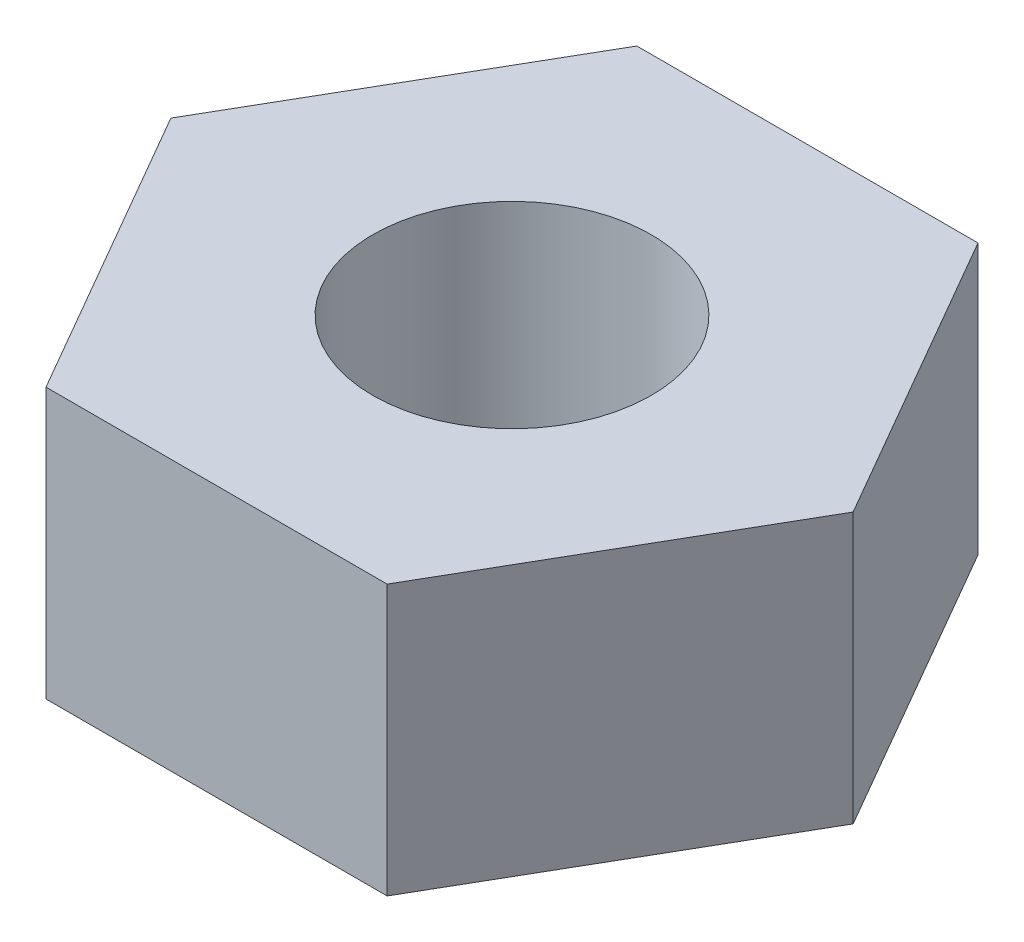
ISO-10303-21;
HEADER;
FILE_DESCRIPTION(('STEP AP214'),'2;1');
FILE_NAME('part.step','',(''),(''),'','','');
FILE_SCHEMA(('AUTOMOTIVE_DESIGN { 1 0 10303 214 1 1 1 1 }'));
ENDSEC;
DATA;
#1=APPLICATION_CONTEXT('core data for automotive mechanical design processes');
#2=APPLICATION_PROTOCOL_DEFINITION('international standard','automotive_design',2000,#1);
#3=PRODUCT_CONTEXT('',#1,'mechanical');
#4=PRODUCT('Part','Part','',(#3));
#5=PRODUCT_RELATED_PRODUCT_CATEGORY('part','',(#4));
#6=PRODUCT_DEFINITION_FORMATION('','',#4);
#7=PRODUCT_DEFINITION_CONTEXT('part definition',#1,'design');
#8=PRODUCT_DEFINITION('design','',#6,#7);
#9=PRODUCT_DEFINITION_SHAPE('','',#8);
#10=(LENGTH_UNIT() NAMED_UNIT(*) SI_UNIT(.MILLI.,.METRE.));
#11=(NAMED_UNIT(*) PLANE_ANGLE_UNIT() SI_UNIT($,.RADIAN.));
#12=(NAMED_UNIT(*) SI_UNIT($,.STERADIAN.) SOLID_ANGLE_UNIT());
#13=UNCERTAINTY_MEASURE_WITH_UNIT(LENGTH_MEASURE(1.E-05),#10,'distance_accuracy_value','');
#14=(GEOMETRIC_REPRESENTATION_CONTEXT(3) GLOBAL_UNCERTAINTY_ASSIGNED_CONTEXT((#13)) GLOBAL_UNIT_ASSIGNED_CONTEXT((#10,
#11,#12)) REPRESENTATION_CONTEXT('',''));
#15=CARTESIAN_POINT('',(0.,0.,0.));
#16=DIRECTION('',(0.,0.,1.));
#17=DIRECTION('',(1.,0.,0.));
#18=AXIS2_PLACEMENT_3D('',#15,#16,#17);
#19=CARTESIAN_POINT('',(0.,3.2,-3.5));
#20=DIRECTION('',(0.,0.,1.));
#21=DIRECTION('',(1.,0.,0.));
#22=AXIS2_PLACEMENT_3D('',#19,#20,#21);
#23=PLANE('',#22);
#24=DIRECTION('',(-1.,0.,0.));
#25=VECTOR('',#24,1.);
#26=CARTESIAN_POINT('',(0.,0.,-3.5));
#27=LINE('',#26,#25);
#28=CARTESIAN_POINT('',(2.02072594216369,0.,-3.5));
#29=VERTEX_POINT('',#28);
#30=CARTESIAN_POINT('',(-2.02072594216369,0.,-3.5));
#31=VERTEX_POINT('',#30);
#32=EDGE_CURVE('E132',#29,#31,#27,.T.);
#33=ORIENTED_EDGE('',*,*,#32,.T.);
#34=DIRECTION('',(0.,-1.,0.));
#35=VECTOR('',#34,1.);
#36=CARTESIAN_POINT('',(-2.02072594216369,3.2,-3.5));
#37=LINE('',#36,#35);
#38=CARTESIAN_POINT('',(-2.02072594216369,3.2,-3.5));
#39=VERTEX_POINT('',#38);
#40=EDGE_CURVE('E11',#39,#31,#37,.T.);
#41=ORIENTED_EDGE('',*,*,#40,.F.);
#42=DIRECTION('',(-1.,0.,0.));
#43=VECTOR('',#42,1.);
#44=CARTESIAN_POINT('',(0.,3.2,-3.5));
#45=LINE('',#44,#43);
#46=CARTESIAN_POINT('',(2.02072594216369,3.2,-3.5));
#47=VERTEX_POINT('',#46);
#48=EDGE_CURVE('E149',#47,#39,#45,.T.);
#49=ORIENTED_EDGE('',*,*,#48,.F.);
#50=DIRECTION('',(0.,-1.,0.));
#51=VECTOR('',#50,1.);
#52=CARTESIAN_POINT('',(2.02072594216369,3.2,-3.5));
#53=LINE('',#52,#51);
#54=EDGE_CURVE('E128',#47,#29,#53,.T.);
#55=ORIENTED_EDGE('',*,*,#54,.T.);
#56=EDGE_LOOP('',(#33,#41,#49,#55));
#57=FACE_BOUND('',#56,.T.);
#58=ADVANCED_FACE('F43',(#57),#23,.F.);
#59=CARTESIAN_POINT('',(-3.03108891324553,3.2,-1.75));
#60=DIRECTION('',(0.866025403784439,0.,0.5));
#61=DIRECTION('',(0.5,0.,-0.866025403784439));
#62=AXIS2_PLACEMENT_3D('',#59,#60,#61);
#63=PLANE('',#62);
#64=DIRECTION('',(-0.5,0.,0.866025403784439));
#65=VECTOR('',#64,1.);
#66=CARTESIAN_POINT('',(-3.03108891324553,0.,-1.75));
#67=LINE('',#66,#65);
#68=CARTESIAN_POINT('',(-4.04145188432738,0.,0.));
#69=VERTEX_POINT('',#68);
#70=EDGE_CURVE('E136',#31,#69,#67,.T.);
#71=ORIENTED_EDGE('',*,*,#70,.T.);
#72=DIRECTION('',(0.,-1.,0.));
#73=VECTOR('',#72,1.);
#74=CARTESIAN_POINT('',(-4.04145188432738,3.2,0.));
#75=LINE('',#74,#73);
#76=CARTESIAN_POINT('',(-4.04145188432738,3.2,0.));
#77=VERTEX_POINT('',#76);
#78=EDGE_CURVE('E52',#77,#69,#75,.T.);
#79=ORIENTED_EDGE('',*,*,#78,.F.);
#80=DIRECTION('',(-0.5,0.,0.866025403784439));
#81=VECTOR('',#80,1.);
#82=CARTESIAN_POINT('',(-3.03108891324553,3.2,-1.75));
#83=LINE('',#82,#81);
#84=EDGE_CURVE('E97',#39,#77,#83,.T.);
#85=ORIENTED_EDGE('',*,*,#84,.F.);
#86=ORIENTED_EDGE('',*,*,#40,.T.);
#87=EDGE_LOOP('',(#71,#79,#85,#86));
#88=FACE_BOUND('',#87,.T.);
#89=ADVANCED_FACE('F178',(#88),#63,.F.);
#90=CARTESIAN_POINT('',(-3.03108891324554,3.2,1.75));
#91=DIRECTION('',(0.866025403784439,0.,-0.5));
#92=DIRECTION('',(-0.5,0.,-0.866025403784439));
#93=AXIS2_PLACEMENT_3D('',#90,#91,#92);
#94=PLANE('',#93);
#95=DIRECTION('',(0.5,0.,0.866025403784439));
#96=VECTOR('',#95,1.);
#97=CARTESIAN_POINT('',(-3.03108891324554,0.,1.75));
#98=LINE('',#97,#96);
#99=CARTESIAN_POINT('',(-2.02072594216369,0.,3.5));
#100=VERTEX_POINT('',#99);
#101=EDGE_CURVE('E140',#69,#100,#98,.T.);
#102=ORIENTED_EDGE('',*,*,#101,.T.);
#103=DIRECTION('',(0.,-1.,0.));
#104=VECTOR('',#103,1.);
#105=CARTESIAN_POINT('',(-2.02072594216369,3.2,3.5));
#106=LINE('',#105,#104);
#107=CARTESIAN_POINT('',(-2.02072594216369,3.2,3.5));
#108=VERTEX_POINT('',#107);
#109=EDGE_CURVE('E121',#108,#100,#106,.T.);
#110=ORIENTED_EDGE('',*,*,#109,.F.);
#111=DIRECTION('',(0.5,0.,0.866025403784439));
#112=VECTOR('',#111,1.);
#113=CARTESIAN_POINT('',(-3.03108891324554,3.2,1.75));
#114=LINE('',#113,#112);
#115=EDGE_CURVE('E110',#77,#108,#114,.T.);
#116=ORIENTED_EDGE('',*,*,#115,.F.);
#117=ORIENTED_EDGE('',*,*,#78,.T.);
#118=EDGE_LOOP('',(#102,#110,#116,#117));
#119=FACE_BOUND('',#118,.T.);
#120=ADVANCED_FACE('F159',(#119),#94,.F.);
#121=CARTESIAN_POINT('',(0.,3.2,3.5));
#122=DIRECTION('',(0.,0.,-1.));
#123=DIRECTION('',(-1.,0.,0.));
#124=AXIS2_PLACEMENT_3D('',#121,#122,#123);
#125=PLANE('',#124);
#126=DIRECTION('',(1.,0.,0.));
#127=VECTOR('',#126,1.);
#128=CARTESIAN_POINT('',(0.,0.,3.5));
#129=LINE('',#128,#127);
#130=CARTESIAN_POINT('',(2.02072594216369,0.,3.5));
#131=VERTEX_POINT('',#130);
#132=EDGE_CURVE('E119',#100,#131,#129,.T.);
#133=ORIENTED_EDGE('',*,*,#132,.T.);
#134=DIRECTION('',(0.,-1.,0.));
#135=VECTOR('',#134,1.);
#136=CARTESIAN_POINT('',(2.02072594216369,3.2,3.5));
#137=LINE('',#136,#135);
#138=CARTESIAN_POINT('',(2.02072594216369,3.2,3.5));
#139=VERTEX_POINT('',#138);
#140=EDGE_CURVE('E116',#139,#131,#137,.T.);
#141=ORIENTED_EDGE('',*,*,#140,.F.);
#142=DIRECTION('',(1.,0.,0.));
#143=VECTOR('',#142,1.);
#144=CARTESIAN_POINT('',(0.,3.2,3.5));
#145=LINE('',#144,#143);
#146=EDGE_CURVE('E104',#108,#139,#145,.T.);
#147=ORIENTED_EDGE('',*,*,#146,.F.);
#148=ORIENTED_EDGE('',*,*,#109,.T.);
#149=EDGE_LOOP('',(#133,#141,#147,#148));
#150=FACE_BOUND('',#149,.T.);
#151=ADVANCED_FACE('F117',(#150),#125,.F.);
#152=CARTESIAN_POINT('',(3.03108891324553,3.2,1.75));
#153=DIRECTION('',(-0.866025403784439,0.,-0.5));
#154=DIRECTION('',(-0.5,0.,0.866025403784439));
#155=AXIS2_PLACEMENT_3D('',#152,#153,#154);
#156=PLANE('',#155);
#157=DIRECTION('',(0.5,0.,-0.866025403784439));
#158=VECTOR('',#157,1.);
#159=CARTESIAN_POINT('',(3.03108891324553,0.,1.75));
#160=LINE('',#159,#158);
#161=CARTESIAN_POINT('',(4.04145188432738,0.,0.));
#162=VERTEX_POINT('',#161);
#163=EDGE_CURVE('E83',#131,#162,#160,.T.);
#164=ORIENTED_EDGE('',*,*,#163,.T.);
#165=DIRECTION('',(0.,-1.,0.));
#166=VECTOR('',#165,1.);
#167=CARTESIAN_POINT('',(4.04145188432738,3.2,0.));
#168=LINE('',#167,#166);
#169=CARTESIAN_POINT('',(4.04145188432738,3.2,0.));
#170=VERTEX_POINT('',#169);
#171=EDGE_CURVE('E122',#170,#162,#168,.T.);
#172=ORIENTED_EDGE('',*,*,#171,.F.);
#173=DIRECTION('',(0.5,0.,-0.866025403784439));
#174=VECTOR('',#173,1.);
#175=CARTESIAN_POINT('',(3.03108891324553,3.2,1.75));
#176=LINE('',#175,#174);
#177=EDGE_CURVE('E108',#139,#170,#176,.T.);
#178=ORIENTED_EDGE('',*,*,#177,.F.);
#179=ORIENTED_EDGE('',*,*,#140,.T.);
#180=EDGE_LOOP('',(#164,#172,#178,#179));
#181=FACE_BOUND('',#180,.T.);
#182=ADVANCED_FACE('F124',(#181),#156,.F.);
#183=CARTESIAN_POINT('',(3.03108891324554,3.2,-1.75));
#184=DIRECTION('',(-0.866025403784439,0.,0.5));
#185=DIRECTION('',(0.5,0.,0.866025403784439));
#186=AXIS2_PLACEMENT_3D('',#183,#184,#185);
#187=PLANE('',#186);
#188=DIRECTION('',(-0.5,0.,-0.866025403784439));
#189=VECTOR('',#188,1.);
#190=CARTESIAN_POINT('',(3.03108891324554,0.,-1.75));
#191=LINE('',#190,#189);
#192=EDGE_CURVE('E89',#162,#29,#191,.T.);
#193=ORIENTED_EDGE('',*,*,#192,.T.);
#194=ORIENTED_EDGE('',*,*,#54,.F.);
#195=DIRECTION('',(-0.5,0.,-0.866025403784439));
#196=VECTOR('',#195,1.);
#197=CARTESIAN_POINT('',(3.03108891324554,3.2,-1.75));
#198=LINE('',#197,#196);
#199=EDGE_CURVE('E60',#170,#47,#198,.T.);
#200=ORIENTED_EDGE('',*,*,#199,.F.);
#201=ORIENTED_EDGE('',*,*,#171,.T.);
#202=EDGE_LOOP('',(#193,#194,#200,#201));
#203=FACE_BOUND('',#202,.T.);
#204=ADVANCED_FACE('F166',(#203),#187,.F.);
#205=CARTESIAN_POINT('',(0.,3.2,0.));
#206=DIRECTION('',(0.,1.,0.));
#207=DIRECTION('',(0.,0.,1.));
#208=AXIS2_PLACEMENT_3D('',#205,#206,#207);
#209=PLANE('',#208);
#210=CARTESIAN_POINT('',(0.,3.2,0.));
#211=DIRECTION('',(0.,1.,0.));
#212=DIRECTION('',(0.,0.,1.));
#213=AXIS2_PLACEMENT_3D('',#210,#211,#212);
#214=CIRCLE('',#213,1.64999999999999);
#215=CARTESIAN_POINT('',(0.,3.2,1.64999999999999));
#216=VERTEX_POINT('',#215);
#217=EDGE_CURVE('E265',#216,#216,#214,.T.);
#218=ORIENTED_EDGE('',*,*,#217,.F.);
#219=EDGE_LOOP('',(#218));
#220=FACE_BOUND('',#219,.T.);
#221=ORIENTED_EDGE('',*,*,#48,.T.);
#222=ORIENTED_EDGE('',*,*,#84,.T.);
#223=ORIENTED_EDGE('',*,*,#115,.T.);
#224=ORIENTED_EDGE('',*,*,#146,.T.);
#225=ORIENTED_EDGE('',*,*,#177,.T.);
#226=ORIENTED_EDGE('',*,*,#199,.T.);
#227=EDGE_LOOP('',(#221,#222,#223,#224,#225,#226));
#228=FACE_BOUND('',#227,.T.);
#229=ADVANCED_FACE('F106',(#220,#228),#209,.T.);
#230=CARTESIAN_POINT('',(0.,0.,0.));
#231=DIRECTION('',(0.,1.,0.));
#232=DIRECTION('',(0.,0.,1.));
#233=AXIS2_PLACEMENT_3D('',#230,#231,#232);
#234=PLANE('',#233);
#235=CARTESIAN_POINT('',(0.,0.,0.));
#236=DIRECTION('',(0.,1.,0.));
#237=DIRECTION('',(0.,0.,1.));
#238=AXIS2_PLACEMENT_3D('',#235,#236,#237);
#239=CIRCLE('',#238,1.65);
#240=CARTESIAN_POINT('',(0.,0.,1.65));
#241=VERTEX_POINT('',#240);
#242=EDGE_CURVE('E137',#241,#241,#239,.T.);
#243=ORIENTED_EDGE('',*,*,#242,.T.);
#244=EDGE_LOOP('',(#243));
#245=FACE_BOUND('',#244,.T.);
#246=ORIENTED_EDGE('',*,*,#32,.F.);
#247=ORIENTED_EDGE('',*,*,#192,.F.);
#248=ORIENTED_EDGE('',*,*,#163,.F.);
#249=ORIENTED_EDGE('',*,*,#132,.F.);
#250=ORIENTED_EDGE('',*,*,#101,.F.);
#251=ORIENTED_EDGE('',*,*,#70,.F.);
#252=EDGE_LOOP('',(#246,#247,#248,#249,#250,#251));
#253=FACE_BOUND('',#252,.T.);
#254=ADVANCED_FACE('F162',(#245,#253),#234,.F.);
#255=CARTESIAN_POINT('',(0.,3.2,0.));
#256=DIRECTION('',(0.,1.,0.));
#257=DIRECTION('',(0.,0.,1.));
#258=AXIS2_PLACEMENT_3D('',#255,#256,#257);
#259=CYLINDRICAL_SURFACE('',#258,1.64999999999999);
#260=ORIENTED_EDGE('',*,*,#242,.F.);
#261=EDGE_LOOP('',(#260));
#262=FACE_BOUND('',#261,.T.);
#263=ORIENTED_EDGE('',*,*,#217,.T.);
#264=EDGE_LOOP('',(#263));
#265=FACE_BOUND('',#264,.T.);
#266=ADVANCED_FACE('F218',(#262,#265),#259,.F.);
#267=CLOSED_SHELL('',(#58,#89,#120,#151,#182,#204,#229,#254,#266));
#268=MANIFOLD_SOLID_BREP('B2',#267);
#269=ADVANCED_BREP_SHAPE_REPRESENTATION('',(#18,#268),#14);
#270=SHAPE_DEFINITION_REPRESENTATION(#9,#269);
ENDSEC;
END-ISO-10303-21;
